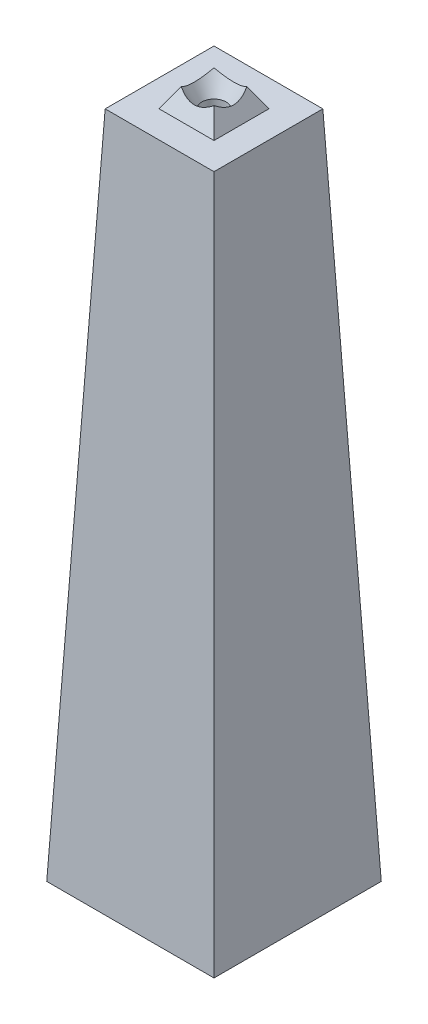
ISO-10303-21;
HEADER;
FILE_DESCRIPTION(('STEP AP214'),'2;1');
FILE_NAME('part.step','',(''),(''),'','','');
FILE_SCHEMA(('AUTOMOTIVE_DESIGN { 1 0 10303 214 1 1 1 1 }'));
ENDSEC;
DATA;
#1=APPLICATION_CONTEXT('core data for automotive mechanical design processes');
#2=APPLICATION_PROTOCOL_DEFINITION('international standard','automotive_design',2000,#1);
#3=PRODUCT_CONTEXT('',#1,'mechanical');
#4=PRODUCT('Part','Part','',(#3));
#5=PRODUCT_RELATED_PRODUCT_CATEGORY('part','',(#4));
#6=PRODUCT_DEFINITION_FORMATION('','',#4);
#7=PRODUCT_DEFINITION_CONTEXT('part definition',#1,'design');
#8=PRODUCT_DEFINITION('design','',#6,#7);
#9=PRODUCT_DEFINITION_SHAPE('','',#8);
#10=(LENGTH_UNIT() NAMED_UNIT(*) SI_UNIT(.MILLI.,.METRE.));
#11=(NAMED_UNIT(*) PLANE_ANGLE_UNIT() SI_UNIT($,.RADIAN.));
#12=(NAMED_UNIT(*) SI_UNIT($,.STERADIAN.) SOLID_ANGLE_UNIT());
#13=UNCERTAINTY_MEASURE_WITH_UNIT(LENGTH_MEASURE(1.E-05),#10,'distance_accuracy_value','');
#14=(GEOMETRIC_REPRESENTATION_CONTEXT(3) GLOBAL_UNCERTAINTY_ASSIGNED_CONTEXT((#13)) GLOBAL_UNIT_ASSIGNED_CONTEXT((#10,
#11,#12)) REPRESENTATION_CONTEXT('',''));
#15=CARTESIAN_POINT('',(0.,0.,0.));
#16=DIRECTION('',(0.,0.,1.));
#17=DIRECTION('',(1.,0.,0.));
#18=AXIS2_PLACEMENT_3D('',#15,#16,#17);
#19=CARTESIAN_POINT('',(0.,190.5,0.));
#20=DIRECTION('',(0.,1.,0.));
#21=DIRECTION('',(0.,0.,1.));
#22=AXIS2_PLACEMENT_3D('',#19,#20,#21);
#23=PLANE('',#22);
#24=DIRECTION('',(0.,0.,-1.));
#25=VECTOR('',#24,1.);
#26=CARTESIAN_POINT('',(8.31740962407157,190.5,0.));
#27=LINE('',#26,#25);
#28=CARTESIAN_POINT('',(8.31740962407157,190.5,8.31740962407157));
#29=VERTEX_POINT('',#28);
#30=CARTESIAN_POINT('',(8.31740962407157,190.5,39.3075903759284));
#31=VERTEX_POINT('',#30);
#32=EDGE_CURVE('E196',#29,#31,#27,.F.);
#33=ORIENTED_EDGE('',*,*,#32,.T.);
#34=DIRECTION('',(-1.,0.,0.));
#35=VECTOR('',#34,1.);
#36=CARTESIAN_POINT('',(0.,190.5,39.3075903759284));
#37=LINE('',#36,#35);
#38=CARTESIAN_POINT('',(39.3075903759284,190.5,39.3075903759284));
#39=VERTEX_POINT('',#38);
#40=EDGE_CURVE('E198',#31,#39,#37,.F.);
#41=ORIENTED_EDGE('',*,*,#40,.T.);
#42=DIRECTION('',(0.,0.,1.));
#43=VECTOR('',#42,1.);
#44=CARTESIAN_POINT('',(39.3075903759284,190.5,0.));
#45=LINE('',#44,#43);
#46=CARTESIAN_POINT('',(39.3075903759284,190.5,8.31740962407157));
#47=VERTEX_POINT('',#46);
#48=EDGE_CURVE('E64',#39,#47,#45,.F.);
#49=ORIENTED_EDGE('',*,*,#48,.T.);
#50=DIRECTION('',(1.,0.,0.));
#51=VECTOR('',#50,1.);
#52=CARTESIAN_POINT('',(0.,190.5,8.31740962407157));
#53=LINE('',#52,#51);
#54=EDGE_CURVE('E199',#47,#29,#53,.F.);
#55=ORIENTED_EDGE('',*,*,#54,.T.);
#56=EDGE_LOOP('',(#33,#41,#49,#55));
#57=FACE_BOUND('',#56,.T.);
#58=DIRECTION('',(1.,0.,0.));
#59=VECTOR('',#58,1.);
#60=CARTESIAN_POINT('',(16.002,190.5,31.623));
#61=LINE('',#60,#59);
#62=CARTESIAN_POINT('',(16.002,190.5,31.623));
#63=VERTEX_POINT('',#62);
#64=CARTESIAN_POINT('',(31.623,190.5,31.623));
#65=VERTEX_POINT('',#64);
#66=EDGE_CURVE('E111',#63,#65,#61,.T.);
#67=ORIENTED_EDGE('',*,*,#66,.F.);
#68=DIRECTION('',(0.,0.,1.));
#69=VECTOR('',#68,1.);
#70=CARTESIAN_POINT('',(16.002,190.5,16.002));
#71=LINE('',#70,#69);
#72=CARTESIAN_POINT('',(16.002,190.5,16.002));
#73=VERTEX_POINT('',#72);
#74=EDGE_CURVE('E121',#73,#63,#71,.T.);
#75=ORIENTED_EDGE('',*,*,#74,.F.);
#76=DIRECTION('',(-1.,0.,0.));
#77=VECTOR('',#76,1.);
#78=CARTESIAN_POINT('',(16.002,190.5,16.002));
#79=LINE('',#78,#77);
#80=CARTESIAN_POINT('',(31.623,190.5,16.002));
#81=VERTEX_POINT('',#80);
#82=EDGE_CURVE('E130',#81,#73,#79,.T.);
#83=ORIENTED_EDGE('',*,*,#82,.F.);
#84=DIRECTION('',(0.,0.,-1.));
#85=VECTOR('',#84,1.);
#86=CARTESIAN_POINT('',(31.623,190.5,16.002));
#87=LINE('',#86,#85);
#88=EDGE_CURVE('E56',#65,#81,#87,.T.);
#89=ORIENTED_EDGE('',*,*,#88,.F.);
#90=EDGE_LOOP('',(#67,#75,#83,#89));
#91=FACE_BOUND('',#90,.T.);
#92=ADVANCED_FACE('F39',(#57,#91),#23,.T.);
#93=CARTESIAN_POINT('',(0.,0.,0.));
#94=DIRECTION('',(-0.999048221581858,0.0436193873653361,0.));
#95=DIRECTION('',(-0.0436193873653361,-0.999048221581858,0.));
#96=AXIS2_PLACEMENT_3D('',#93,#94,#95);
#97=PLANE('',#96);
#98=ORIENTED_EDGE('',*,*,#32,.F.);
#99=DIRECTION('',(-0.0435779502517479,-0.998099155647229,-0.0435779502517479));
#100=VECTOR('',#99,1.);
#101=CARTESIAN_POINT('',(0.,0.,0.));
#102=LINE('',#101,#100);
#103=CARTESIAN_POINT('',(0.,0.,0.));
#104=VERTEX_POINT('',#103);
#105=EDGE_CURVE('E212',#29,#104,#102,.T.);
#106=ORIENTED_EDGE('',*,*,#105,.T.);
#107=DIRECTION('',(0.,0.,1.));
#108=VECTOR('',#107,1.);
#109=CARTESIAN_POINT('',(0.,0.,0.));
#110=LINE('',#109,#108);
#111=CARTESIAN_POINT('',(0.,0.,47.625));
#112=VERTEX_POINT('',#111);
#113=EDGE_CURVE('E211',#104,#112,#110,.T.);
#114=ORIENTED_EDGE('',*,*,#113,.T.);
#115=DIRECTION('',(-0.0435779502517479,-0.998099155647229,0.0435779502517479));
#116=VECTOR('',#115,1.);
#117=CARTESIAN_POINT('',(0.,0.,47.625));
#118=LINE('',#117,#116);
#119=EDGE_CURVE('E11',#31,#112,#118,.T.);
#120=ORIENTED_EDGE('',*,*,#119,.F.);
#121=EDGE_LOOP('',(#98,#106,#114,#120));
#122=FACE_BOUND('',#121,.T.);
#123=ADVANCED_FACE('F188',(#122),#97,.T.);
#124=CARTESIAN_POINT('',(0.,0.,47.625));
#125=DIRECTION('',(0.,0.0436193873653361,0.999048221581858));
#126=DIRECTION('',(0.,-0.999048221581858,0.0436193873653361));
#127=AXIS2_PLACEMENT_3D('',#124,#125,#126);
#128=PLANE('',#127);
#129=ORIENTED_EDGE('',*,*,#40,.F.);
#130=ORIENTED_EDGE('',*,*,#119,.T.);
#131=DIRECTION('',(1.,0.,0.));
#132=VECTOR('',#131,1.);
#133=CARTESIAN_POINT('',(0.,0.,47.625));
#134=LINE('',#133,#132);
#135=CARTESIAN_POINT('',(47.625,0.,47.625));
#136=VERTEX_POINT('',#135);
#137=EDGE_CURVE('E216',#112,#136,#134,.T.);
#138=ORIENTED_EDGE('',*,*,#137,.T.);
#139=DIRECTION('',(0.0435779502517479,-0.998099155647229,0.0435779502517479));
#140=VECTOR('',#139,1.);
#141=CARTESIAN_POINT('',(47.5345583272447,2.07145486859645,47.5345583272447));
#142=LINE('',#141,#140);
#143=EDGE_CURVE('E48',#39,#136,#142,.T.);
#144=ORIENTED_EDGE('',*,*,#143,.F.);
#145=EDGE_LOOP('',(#129,#130,#138,#144));
#146=FACE_BOUND('',#145,.T.);
#147=ADVANCED_FACE('F41',(#146),#128,.T.);
#148=CARTESIAN_POINT('',(47.625,0.,0.));
#149=DIRECTION('',(0.999048221581858,0.0436193873653361,0.));
#150=DIRECTION('',(-0.0436193873653361,0.999048221581858,0.));
#151=AXIS2_PLACEMENT_3D('',#148,#149,#150);
#152=PLANE('',#151);
#153=ORIENTED_EDGE('',*,*,#48,.F.);
#154=ORIENTED_EDGE('',*,*,#143,.T.);
#155=DIRECTION('',(0.,0.,-1.));
#156=VECTOR('',#155,1.);
#157=CARTESIAN_POINT('',(47.625,0.,0.));
#158=LINE('',#157,#156);
#159=CARTESIAN_POINT('',(47.625,0.,0.));
#160=VERTEX_POINT('',#159);
#161=EDGE_CURVE('E218',#136,#160,#158,.T.);
#162=ORIENTED_EDGE('',*,*,#161,.T.);
#163=DIRECTION('',(0.0435779502517479,-0.998099155647229,-0.0435779502517479));
#164=VECTOR('',#163,1.);
#165=CARTESIAN_POINT('',(47.5345583272446,2.07145486859645,0.090441672755349));
#166=LINE('',#165,#164);
#167=EDGE_CURVE('E228',#47,#160,#166,.T.);
#168=ORIENTED_EDGE('',*,*,#167,.F.);
#169=EDGE_LOOP('',(#153,#154,#162,#168));
#170=FACE_BOUND('',#169,.T.);
#171=ADVANCED_FACE('F230',(#170),#152,.T.);
#172=CARTESIAN_POINT('',(0.,0.,0.));
#173=DIRECTION('',(0.,0.0436193873653361,-0.999048221581858));
#174=DIRECTION('',(0.,0.999048221581858,0.0436193873653361));
#175=AXIS2_PLACEMENT_3D('',#172,#173,#174);
#176=PLANE('',#175);
#177=ORIENTED_EDGE('',*,*,#54,.F.);
#178=ORIENTED_EDGE('',*,*,#167,.T.);
#179=DIRECTION('',(-1.,0.,0.));
#180=VECTOR('',#179,1.);
#181=CARTESIAN_POINT('',(0.,0.,0.));
#182=LINE('',#181,#180);
#183=EDGE_CURVE('E225',#160,#104,#182,.T.);
#184=ORIENTED_EDGE('',*,*,#183,.T.);
#185=ORIENTED_EDGE('',*,*,#105,.F.);
#186=EDGE_LOOP('',(#177,#178,#184,#185));
#187=FACE_BOUND('',#186,.T.);
#188=ADVANCED_FACE('F234',(#187),#176,.T.);
#189=CARTESIAN_POINT('',(23.8125,381.,23.8125));
#190=DIRECTION('',(0.,-1.,0.));
#191=DIRECTION('',(0.,0.,-1.));
#192=AXIS2_PLACEMENT_3D('',#189,#190,#191);
#193=CYLINDRICAL_SURFACE('',#192,3.429);
#194=CARTESIAN_POINT('',(23.8125,0.,23.8125));
#195=DIRECTION('',(0.,-1.,0.));
#196=DIRECTION('',(0.,0.,-1.));
#197=AXIS2_PLACEMENT_3D('',#194,#195,#196);
#198=CIRCLE('',#197,3.429);
#199=CARTESIAN_POINT('',(23.8125,0.,20.3835));
#200=VERTEX_POINT('',#199);
#201=EDGE_CURVE('E202',#200,#200,#198,.T.);
#202=ORIENTED_EDGE('',*,*,#201,.T.);
#203=EDGE_LOOP('',(#202));
#204=FACE_BOUND('',#203,.T.);
#205=CARTESIAN_POINT('',(23.8125,190.5,23.8125));
#206=DIRECTION('',(0.,1.,0.));
#207=DIRECTION('',(0.,0.,1.));
#208=AXIS2_PLACEMENT_3D('',#205,#206,#207);
#209=CIRCLE('',#208,3.429);
#210=CARTESIAN_POINT('',(23.8125,190.5,27.2415));
#211=VERTEX_POINT('',#210);
#212=EDGE_CURVE('E43',#211,#211,#209,.F.);
#213=ORIENTED_EDGE('',*,*,#212,.F.);
#214=EDGE_LOOP('',(#213));
#215=FACE_BOUND('',#214,.T.);
#216=ADVANCED_FACE('F240',(#204,#215),#193,.F.);
#217=CARTESIAN_POINT('',(0.,0.,0.));
#218=DIRECTION('',(0.,1.,0.));
#219=DIRECTION('',(0.,0.,1.));
#220=AXIS2_PLACEMENT_3D('',#217,#218,#219);
#221=PLANE('',#220);
#222=ORIENTED_EDGE('',*,*,#201,.F.);
#223=EDGE_LOOP('',(#222));
#224=FACE_BOUND('',#223,.T.);
#225=ORIENTED_EDGE('',*,*,#113,.F.);
#226=ORIENTED_EDGE('',*,*,#183,.F.);
#227=ORIENTED_EDGE('',*,*,#161,.F.);
#228=ORIENTED_EDGE('',*,*,#137,.F.);
#229=EDGE_LOOP('',(#225,#226,#227,#228));
#230=FACE_BOUND('',#229,.T.);
#231=ADVANCED_FACE('F157',(#224,#230),#221,.F.);
#232=CARTESIAN_POINT('',(23.8125,190.5,23.8125));
#233=DIRECTION('',(0.,1.,0.));
#234=DIRECTION('',(0.,0.,1.));
#235=AXIS2_PLACEMENT_3D('',#232,#233,#234);
#236=CONICAL_SURFACE('',#235,3.429,0.5235987755983);
#237=ORIENTED_EDGE('',*,*,#212,.T.);
#238=EDGE_LOOP('',(#237));
#239=FACE_BOUND('',#238,.T.);
#240=CARTESIAN_POINT('',(27.956710320592,196.8502,29.5717235981434));
#241=CARTESIAN_POINT('',(28.0081323623795,196.761134410995,29.4713633439768));
#242=CARTESIAN_POINT('',(28.058901147704,196.673200295375,29.3696688244712));
#243=CARTESIAN_POINT('',(28.1589874871974,196.499845670228,29.1634177978636));
#244=CARTESIAN_POINT('',(28.2083046955904,196.414425759604,29.0588606201233));
#245=CARTESIAN_POINT('',(28.3541638434062,196.161790304839,28.7399375167267));
#246=CARTESIAN_POINT('',(28.4482525522244,195.998823880747,28.5210173220777));
#247=CARTESIAN_POINT('',(28.629861655085,195.684267687475,28.0656985218887));
#248=CARTESIAN_POINT('',(28.717225871974,195.53294842506,27.829049212438));
#249=CARTESIAN_POINT('',(28.8809444662537,195.249379501624,27.3412572281908));
#250=CARTESIAN_POINT('',(28.9573155063829,195.117100979893,27.0901373136578));
#251=CARTESIAN_POINT('',(29.0687968483862,194.924009631448,26.6751114965386));
#252=CARTESIAN_POINT('',(29.1082952728107,194.855596353526,26.5159025037141));
#253=CARTESIAN_POINT('',(29.1814947323029,194.728811170598,26.1921882833746));
#254=CARTESIAN_POINT('',(29.2151955750317,194.670439598734,26.0276828803624));
#255=CARTESIAN_POINT('',(29.2758636525543,194.565359406068,25.6947737922541));
#256=CARTESIAN_POINT('',(29.3028668941915,194.518588419583,25.5263965163288));
#257=CARTESIAN_POINT('',(29.3496598641811,194.437540618124,25.1856559610529));
#258=CARTESIAN_POINT('',(29.3694498950815,194.403263279121,25.0132928492052));
#259=CARTESIAN_POINT('',(29.4013912868527,194.347939165709,24.6637102617785));
#260=CARTESIAN_POINT('',(29.4134534189008,194.327046940154,24.4864578729925));
#261=CARTESIAN_POINT('',(29.4291618609886,194.29983912035,24.1304560582134));
#262=CARTESIAN_POINT('',(29.4328082527425,194.293523384568,23.9517066467727));
#263=CARTESIAN_POINT('',(29.4315529760501,194.295697587577,23.5943067876001));
#264=CARTESIAN_POINT('',(29.4266501885338,194.304189464654,23.4156563558865));
#265=CARTESIAN_POINT('',(29.4084712981696,194.33567622639,23.0600833599351));
#266=CARTESIAN_POINT('',(29.3951954273272,194.358670709204,22.8831607479602));
#267=CARTESIAN_POINT('',(29.3625571218628,194.415201912541,22.5510648433335));
#268=CARTESIAN_POINT('',(29.3439893162406,194.447362295264,22.3955745310005));
#269=CARTESIAN_POINT('',(29.3009864205335,194.521845495501,22.0878698309277));
#270=CARTESIAN_POINT('',(29.2765506147325,194.564169552672,21.9356558452689));
#271=CARTESIAN_POINT('',(29.2222308076464,194.658254218403,21.6344734718811));
#272=CARTESIAN_POINT('',(29.1923246189891,194.710053256618,21.4855211733471));
#273=CARTESIAN_POINT('',(29.1276982494997,194.821989412082,21.1918932661529));
#274=CARTESIAN_POINT('',(29.0929781859858,194.88212632613,21.0472175533728));
#275=CARTESIAN_POINT('',(28.9863508157211,195.066810348906,20.6350638534292));
#276=CARTESIAN_POINT('',(28.9089178533378,195.200928173934,20.3732680214732));
#277=CARTESIAN_POINT('',(28.7419687754171,195.49009245917,19.8651474813778));
#278=CARTESIAN_POINT('',(28.6524302770016,195.645177687659,19.6188527008429));
#279=CARTESIAN_POINT('',(28.511889339597,195.888601731787,19.2624927506049));
#280=CARTESIAN_POINT('',(28.4644117510802,195.970835327319,19.1467708093315));
#281=CARTESIAN_POINT('',(28.3674383261517,196.138798226279,18.9187378219393));
#282=CARTESIAN_POINT('',(28.3179423414553,196.224527786544,18.8064270274872));
#283=CARTESIAN_POINT('',(28.2173832535902,196.398701235889,18.5855371025006));
#284=CARTESIAN_POINT('',(28.1663277593534,196.487131945913,18.4769440647886));
#285=CARTESIAN_POINT('',(28.0626501651382,196.6667068067,18.2628457173472));
#286=CARTESIAN_POINT('',(28.0100284905361,196.75785022069,18.1573395843732));
#287=CARTESIAN_POINT('',(27.956710320592,196.8502,18.0532764018566));
#288=B_SPLINE_CURVE_WITH_KNOTS('',3,(#240,#241,#242,#243,#244,#245,#246,#247,#248,#249,#250,
#251,#252,#253,#254,#255,#256,#257,#258,#259,#260,#261,#262,#263,#264,#265,#266,#267,#268,#269,
#270,#271,#272,#273,#274,#275,#276,#277,#278,#279,#280,#281,#282,#283,#284,#285,#286,#287),
.UNSPECIFIED.,.F.,.F.,(4,2,2,2,2,2,2,2,2,2,2,2,2,2,2,2,2,2,2,2,2,2,2,4),(0.,0.431069751364838,
0.862241368956554,1.72759013397606,2.60915931907157,3.48937788189382,4.02218378409016,
4.55500735909969,5.08490112039099,5.6147726534632,6.15065695199229,6.68653604722868,
7.22248529320639,7.75841968949851,8.23752784730629,8.71669447132412,9.19784947299534,
9.67899275056092,10.5897014409924,11.5021176477477,11.9511220458907,12.4001594905094,
12.8472761877539,13.2942725362773),.UNSPECIFIED.);
#289=CARTESIAN_POINT('',(28.4680533342924,195.964527920176,28.4680533342924));
#290=VERTEX_POINT('',#289);
#291=CARTESIAN_POINT('',(28.4680533342924,195.964527920176,19.1569466657076));
#292=VERTEX_POINT('',#291);
#293=EDGE_CURVE('E166',#290,#292,#288,.T.);
#294=ORIENTED_EDGE('',*,*,#293,.T.);
#295=CARTESIAN_POINT('',(29.5717235981434,196.8502,19.668289679408));
#296=CARTESIAN_POINT('',(29.4713633439768,196.761134410995,19.6168676376205));
#297=CARTESIAN_POINT('',(29.3696688244712,196.673200295375,19.566098852296));
#298=CARTESIAN_POINT('',(29.1634177978636,196.499845670228,19.4660125128026));
#299=CARTESIAN_POINT('',(29.0588606201233,196.414425759604,19.4166953044096));
#300=CARTESIAN_POINT('',(28.7399375167267,196.161790304839,19.2708361565938));
#301=CARTESIAN_POINT('',(28.5210173220777,195.998823880747,19.1767474477756));
#302=CARTESIAN_POINT('',(28.0656985218887,195.684267687475,18.995138344915));
#303=CARTESIAN_POINT('',(27.829049212438,195.53294842506,18.907774128026));
#304=CARTESIAN_POINT('',(27.3412572281908,195.249379501624,18.7440555337463));
#305=CARTESIAN_POINT('',(27.0901373136578,195.117100979893,18.6676844936171));
#306=CARTESIAN_POINT('',(26.6751114965386,194.924009631448,18.5562031516138));
#307=CARTESIAN_POINT('',(26.5159025037141,194.855596353526,18.5167047271893));
#308=CARTESIAN_POINT('',(26.1921882833746,194.728811170598,18.4435052676971));
#309=CARTESIAN_POINT('',(26.0276828803624,194.670439598734,18.4098044249683));
#310=CARTESIAN_POINT('',(25.6947737922541,194.565359406068,18.3491363474457));
#311=CARTESIAN_POINT('',(25.5263965163288,194.518588419583,18.3221331058085));
#312=CARTESIAN_POINT('',(25.1856559610529,194.437540618124,18.2753401358189));
#313=CARTESIAN_POINT('',(25.0132928492052,194.403263279121,18.2555501049185));
#314=CARTESIAN_POINT('',(24.6637102617785,194.347939165709,18.2236087131473));
#315=CARTESIAN_POINT('',(24.4864578729925,194.327046940154,18.2115465810992));
#316=CARTESIAN_POINT('',(24.1304560582134,194.29983912035,18.1958381390114));
#317=CARTESIAN_POINT('',(23.9517066467727,194.293523384568,18.1921917472575));
#318=CARTESIAN_POINT('',(23.5943067876001,194.295697587577,18.1934470239499));
#319=CARTESIAN_POINT('',(23.4156563558865,194.304189464654,18.1983498114662));
#320=CARTESIAN_POINT('',(23.0600833599351,194.33567622639,18.2165287018304));
#321=CARTESIAN_POINT('',(22.8831607479602,194.358670709204,18.2298045726728));
#322=CARTESIAN_POINT('',(22.5510648433335,194.415201912541,18.2624428781372));
#323=CARTESIAN_POINT('',(22.3955745310005,194.447362295264,18.2810106837594));
#324=CARTESIAN_POINT('',(22.0878698309277,194.521845495501,18.3240135794665));
#325=CARTESIAN_POINT('',(21.9356558452689,194.564169552672,18.3484493852675));
#326=CARTESIAN_POINT('',(21.6344734718811,194.658254218403,18.4027691923536));
#327=CARTESIAN_POINT('',(21.4855211733471,194.710053256618,18.4326753810109));
#328=CARTESIAN_POINT('',(21.1918932661529,194.821989412082,18.4973017505003));
#329=CARTESIAN_POINT('',(21.0472175533728,194.88212632613,18.5320218140142));
#330=CARTESIAN_POINT('',(20.6350638534292,195.066810348906,18.6386491842789));
#331=CARTESIAN_POINT('',(20.3732680214732,195.200928173934,18.7160821466622));
#332=CARTESIAN_POINT('',(19.8651474813778,195.49009245917,18.883031224583));
#333=CARTESIAN_POINT('',(19.6188527008429,195.645177687659,18.9725697229984));
#334=CARTESIAN_POINT('',(19.2624927506049,195.888601731787,19.113110660403));
#335=CARTESIAN_POINT('',(19.1467708093315,195.970835327319,19.1605882489199));
#336=CARTESIAN_POINT('',(18.9187378219393,196.138798226279,19.2575616738483));
#337=CARTESIAN_POINT('',(18.8064270274872,196.224527786544,19.3070576585447));
#338=CARTESIAN_POINT('',(18.5855371025006,196.398701235889,19.4076167464099));
#339=CARTESIAN_POINT('',(18.4769440647886,196.487131945913,19.4586722406466));
#340=CARTESIAN_POINT('',(18.2628457173472,196.6667068067,19.5623498348619));
#341=CARTESIAN_POINT('',(18.1573395843732,196.75785022069,19.6149715094639));
#342=CARTESIAN_POINT('',(18.0532764018566,196.8502,19.668289679408));
#343=B_SPLINE_CURVE_WITH_KNOTS('',3,(#295,#296,#297,#298,#299,#300,#301,#302,#303,#304,#305,
#306,#307,#308,#309,#310,#311,#312,#313,#314,#315,#316,#317,#318,#319,#320,#321,#322,#323,#324,
#325,#326,#327,#328,#329,#330,#331,#332,#333,#334,#335,#336,#337,#338,#339,#340,#341,#342),
.UNSPECIFIED.,.F.,.F.,(4,2,2,2,2,2,2,2,2,2,2,2,2,2,2,2,2,2,2,2,2,2,2,4),(0.,0.431069751364856,
0.862241368956557,1.72759013397606,2.60915931907158,3.48937788189382,4.02218378409016,
4.5550073590997,5.08490112039099,5.61477265346321,6.15065695199229,6.68653604722868,
7.22248529320639,7.7584196894985,8.23752784730628,8.71669447132413,9.19784947299533,
9.67899275056092,10.5897014409924,11.5021176477477,11.9511220458907,12.4001594905094,
12.8472761877539,13.2942725362773),.UNSPECIFIED.);
#344=CARTESIAN_POINT('',(19.1569466657076,195.964527920176,19.1569466657076));
#345=VERTEX_POINT('',#344);
#346=EDGE_CURVE('E172',#292,#345,#343,.T.);
#347=ORIENTED_EDGE('',*,*,#346,.T.);
#348=CARTESIAN_POINT('',(19.668289679408,196.8502,18.0532764018566));
#349=CARTESIAN_POINT('',(19.6168676376206,196.761134410995,18.1536366560232));
#350=CARTESIAN_POINT('',(19.566098852296,196.673200295375,18.2553311755288));
#351=CARTESIAN_POINT('',(19.4660125128026,196.499845670228,18.4615822021364));
#352=CARTESIAN_POINT('',(19.4166953044096,196.414425759604,18.5661393798766));
#353=CARTESIAN_POINT('',(19.2708361565938,196.161790304839,18.8850624832733));
#354=CARTESIAN_POINT('',(19.1767474477756,195.998823880747,19.1039826779223));
#355=CARTESIAN_POINT('',(18.995138344915,195.684267687475,19.5593014781113));
#356=CARTESIAN_POINT('',(18.907774128026,195.53294842506,19.795950787562));
#357=CARTESIAN_POINT('',(18.7440555337463,195.249379501624,20.2837427718092));
#358=CARTESIAN_POINT('',(18.6676844936171,195.117100979893,20.5348626863422));
#359=CARTESIAN_POINT('',(18.5562031516138,194.924009631448,20.9498885034614));
#360=CARTESIAN_POINT('',(18.5167047271893,194.855596353526,21.1090974962859));
#361=CARTESIAN_POINT('',(18.4435052676971,194.728811170598,21.4328117166254));
#362=CARTESIAN_POINT('',(18.4098044249683,194.670439598734,21.5973171196376));
#363=CARTESIAN_POINT('',(18.3491363474457,194.565359406068,21.9302262077459));
#364=CARTESIAN_POINT('',(18.3221331058085,194.518588419583,22.0986034836712));
#365=CARTESIAN_POINT('',(18.2753401358189,194.437540618124,22.4393440389472));
#366=CARTESIAN_POINT('',(18.2555501049185,194.403263279121,22.6117071507948));
#367=CARTESIAN_POINT('',(18.2236087131473,194.347939165709,22.9612897382215));
#368=CARTESIAN_POINT('',(18.2115465810992,194.327046940154,23.1385421270075));
#369=CARTESIAN_POINT('',(18.1958381390114,194.29983912035,23.4945439417866));
#370=CARTESIAN_POINT('',(18.1921917472575,194.293523384568,23.6732933532273));
#371=CARTESIAN_POINT('',(18.1934470239499,194.295697587577,24.0306932123999));
#372=CARTESIAN_POINT('',(18.1983498114662,194.304189464654,24.2093436441135));
#373=CARTESIAN_POINT('',(18.2165287018304,194.33567622639,24.5649166400649));
#374=CARTESIAN_POINT('',(18.2298045726728,194.358670709204,24.7418392520398));
#375=CARTESIAN_POINT('',(18.2624428781372,194.415201912541,25.0739351566665));
#376=CARTESIAN_POINT('',(18.2810106837594,194.447362295264,25.2294254689995));
#377=CARTESIAN_POINT('',(18.3240135794665,194.521845495501,25.5371301690723));
#378=CARTESIAN_POINT('',(18.3484493852675,194.564169552672,25.6893441547311));
#379=CARTESIAN_POINT('',(18.4027691923536,194.658254218403,25.9905265281189));
#380=CARTESIAN_POINT('',(18.4326753810109,194.710053256618,26.1394788266529));
#381=CARTESIAN_POINT('',(18.4973017505003,194.821989412082,26.4331067338471));
#382=CARTESIAN_POINT('',(18.5320218140142,194.88212632613,26.5777824466272));
#383=CARTESIAN_POINT('',(18.6386491842789,195.066810348906,26.9899361465709));
#384=CARTESIAN_POINT('',(18.7160821466622,195.200928173934,27.2517319785268));
#385=CARTESIAN_POINT('',(18.8830312245829,195.49009245917,27.7598525186222));
#386=CARTESIAN_POINT('',(18.9725697229984,195.645177687659,28.0061472991571));
#387=CARTESIAN_POINT('',(19.113110660403,195.888601731787,28.3625072493951));
#388=CARTESIAN_POINT('',(19.1605882489198,195.970835327319,28.4782291906685));
#389=CARTESIAN_POINT('',(19.2575616738483,196.138798226279,28.7062621780607));
#390=CARTESIAN_POINT('',(19.3070576585447,196.224527786544,28.8185729725128));
#391=CARTESIAN_POINT('',(19.4076167464098,196.398701235889,29.0394628974994));
#392=CARTESIAN_POINT('',(19.4586722406466,196.487131945913,29.1480559352114));
#393=CARTESIAN_POINT('',(19.5623498348618,196.6667068067,29.3621542826528));
#394=CARTESIAN_POINT('',(19.6149715094639,196.75785022069,29.4676604156268));
#395=CARTESIAN_POINT('',(19.668289679408,196.8502,29.5717235981434));
#396=B_SPLINE_CURVE_WITH_KNOTS('',3,(#348,#349,#350,#351,#352,#353,#354,#355,#356,#357,#358,
#359,#360,#361,#362,#363,#364,#365,#366,#367,#368,#369,#370,#371,#372,#373,#374,#375,#376,#377,
#378,#379,#380,#381,#382,#383,#384,#385,#386,#387,#388,#389,#390,#391,#392,#393,#394,#395),
.UNSPECIFIED.,.F.,.F.,(4,2,2,2,2,2,2,2,2,2,2,2,2,2,2,2,2,2,2,2,2,2,2,4),(0.,0.43106975136482,
0.862241368956516,1.72759013397603,2.60915931907153,3.48937788189381,4.02218378409014,
4.55500735909968,5.08490112039099,5.6147726534632,6.15065695199228,6.68653604722867,
7.22248529320638,7.75841968949849,8.23752784730626,8.71669447132411,9.19784947299532,
9.67899275056091,10.5897014409924,11.5021176477477,11.9511220458907,12.4001594905094,
12.8472761877538,13.2942725362773),.UNSPECIFIED.);
#397=CARTESIAN_POINT('',(19.1569466657076,195.964527920176,28.4680533342924));
#398=VERTEX_POINT('',#397);
#399=EDGE_CURVE('E117',#345,#398,#396,.T.);
#400=ORIENTED_EDGE('',*,*,#399,.T.);
#401=CARTESIAN_POINT('',(18.0532764018566,196.8502,27.956710320592));
#402=CARTESIAN_POINT('',(18.1536366560232,196.761134410995,28.0081323623795));
#403=CARTESIAN_POINT('',(18.2553311755288,196.673200295375,28.058901147704));
#404=CARTESIAN_POINT('',(18.4615822021364,196.499845670228,28.1589874871974));
#405=CARTESIAN_POINT('',(18.5661393798766,196.414425759604,28.2083046955904));
#406=CARTESIAN_POINT('',(18.8850624832733,196.161790304839,28.3541638434062));
#407=CARTESIAN_POINT('',(19.1039826779223,195.998823880747,28.4482525522244));
#408=CARTESIAN_POINT('',(19.5593014781113,195.684267687475,28.629861655085));
#409=CARTESIAN_POINT('',(19.795950787562,195.53294842506,28.717225871974));
#410=CARTESIAN_POINT('',(20.2837427718092,195.249379501624,28.8809444662537));
#411=CARTESIAN_POINT('',(20.5348626863422,195.117100979893,28.9573155063829));
#412=CARTESIAN_POINT('',(20.9498885034614,194.924009631448,29.0687968483862));
#413=CARTESIAN_POINT('',(21.109097496286,194.855596353526,29.1082952728107));
#414=CARTESIAN_POINT('',(21.4328117166254,194.728811170598,29.1814947323029));
#415=CARTESIAN_POINT('',(21.5973171196376,194.670439598734,29.2151955750317));
#416=CARTESIAN_POINT('',(21.9302262077459,194.565359406068,29.2758636525543));
#417=CARTESIAN_POINT('',(22.0986034836712,194.518588419583,29.3028668941915));
#418=CARTESIAN_POINT('',(22.4393440389472,194.437540618124,29.3496598641811));
#419=CARTESIAN_POINT('',(22.6117071507948,194.403263279121,29.3694498950815));
#420=CARTESIAN_POINT('',(22.9612897382215,194.347939165709,29.4013912868527));
#421=CARTESIAN_POINT('',(23.1385421270075,194.327046940154,29.4134534189008));
#422=CARTESIAN_POINT('',(23.4945439417867,194.29983912035,29.4291618609886));
#423=CARTESIAN_POINT('',(23.6732933532273,194.293523384568,29.4328082527425));
#424=CARTESIAN_POINT('',(24.0306932123999,194.295697587577,29.4315529760501));
#425=CARTESIAN_POINT('',(24.2093436441136,194.304189464654,29.4266501885338));
#426=CARTESIAN_POINT('',(24.5649166400649,194.33567622639,29.4084712981696));
#427=CARTESIAN_POINT('',(24.7418392520398,194.358670709204,29.3951954273272));
#428=CARTESIAN_POINT('',(25.0739351566665,194.415201912541,29.3625571218628));
#429=CARTESIAN_POINT('',(25.2294254689995,194.447362295264,29.3439893162406));
#430=CARTESIAN_POINT('',(25.5371301690723,194.521845495501,29.3009864205335));
#431=CARTESIAN_POINT('',(25.6893441547311,194.564169552672,29.2765506147325));
#432=CARTESIAN_POINT('',(25.9905265281189,194.658254218403,29.2222308076464));
#433=CARTESIAN_POINT('',(26.1394788266529,194.710053256618,29.1923246189891));
#434=CARTESIAN_POINT('',(26.4331067338471,194.821989412082,29.1276982494997));
#435=CARTESIAN_POINT('',(26.5777824466272,194.88212632613,29.0929781859858));
#436=CARTESIAN_POINT('',(26.9899361465709,195.066810348906,28.9863508157211));
#437=CARTESIAN_POINT('',(27.2517319785268,195.200928173934,28.9089178533378));
#438=CARTESIAN_POINT('',(27.7598525186222,195.49009245917,28.7419687754171));
#439=CARTESIAN_POINT('',(28.0061472991571,195.645177687659,28.6524302770016));
#440=CARTESIAN_POINT('',(28.3625072493952,195.888601731787,28.511889339597));
#441=CARTESIAN_POINT('',(28.4782291906685,195.970835327319,28.4644117510801));
#442=CARTESIAN_POINT('',(28.7062621780608,196.138798226279,28.3674383261517));
#443=CARTESIAN_POINT('',(28.8185729725129,196.224527786544,28.3179423414553));
#444=CARTESIAN_POINT('',(29.0394628974994,196.398701235889,28.2173832535902));
#445=CARTESIAN_POINT('',(29.1480559352114,196.487131945913,28.1663277593534));
#446=CARTESIAN_POINT('',(29.3621542826528,196.6667068067,28.0626501651382));
#447=CARTESIAN_POINT('',(29.4676604156268,196.75785022069,28.0100284905361));
#448=CARTESIAN_POINT('',(29.5717235981434,196.8502,27.956710320592));
#449=B_SPLINE_CURVE_WITH_KNOTS('',3,(#401,#402,#403,#404,#405,#406,#407,#408,#409,#410,#411,
#412,#413,#414,#415,#416,#417,#418,#419,#420,#421,#422,#423,#424,#425,#426,#427,#428,#429,#430,
#431,#432,#433,#434,#435,#436,#437,#438,#439,#440,#441,#442,#443,#444,#445,#446,#447,#448),
.UNSPECIFIED.,.F.,.F.,(4,2,2,2,2,2,2,2,2,2,2,2,2,2,2,2,2,2,2,2,2,2,2,4),(0.,0.431069751364829,
0.862241368956516,1.72759013397603,2.60915931907156,3.48937788189382,4.02218378409015,
4.5550073590997,5.08490112039099,5.61477265346321,6.1506569519923,6.68653604722868,
7.22248529320639,7.7584196894985,8.23752784730629,8.71669447132412,9.19784947299533,
9.67899275056092,10.5897014409924,11.5021176477477,11.9511220458907,12.4001594905094,
12.8472761877538,13.2942725362773),.UNSPECIFIED.);
#450=EDGE_CURVE('E113',#398,#290,#449,.T.);
#451=ORIENTED_EDGE('',*,*,#450,.T.);
#452=EDGE_LOOP('',(#294,#347,#400,#451));
#453=FACE_BOUND('',#452,.T.);
#454=ADVANCED_FACE('F153',(#239,#453),#236,.F.);
#455=CARTESIAN_POINT('',(16.002,190.5,16.002));
#456=DIRECTION('',(-0.866025403784438,0.500000000000001,0.));
#457=DIRECTION('',(-0.500000000000001,-0.866025403784438,0.));
#458=AXIS2_PLACEMENT_3D('',#455,#456,#457);
#459=PLANE('',#458);
#460=ORIENTED_EDGE('',*,*,#399,.F.);
#461=DIRECTION('',(-0.447213595499959,-0.774596669241482,-0.447213595499959));
#462=VECTOR('',#461,1.);
#463=CARTESIAN_POINT('',(16.002,190.5,16.002));
#464=LINE('',#463,#462);
#465=EDGE_CURVE('E124',#345,#73,#464,.T.);
#466=ORIENTED_EDGE('',*,*,#465,.T.);
#467=ORIENTED_EDGE('',*,*,#74,.T.);
#468=DIRECTION('',(-0.447213595499959,-0.774596669241482,0.447213595499959));
#469=VECTOR('',#468,1.);
#470=CARTESIAN_POINT('',(16.002,190.5,31.623));
#471=LINE('',#470,#469);
#472=EDGE_CURVE('E106',#398,#63,#471,.T.);
#473=ORIENTED_EDGE('',*,*,#472,.F.);
#474=EDGE_LOOP('',(#460,#466,#467,#473));
#475=FACE_BOUND('',#474,.T.);
#476=ADVANCED_FACE('F122',(#475),#459,.T.);
#477=CARTESIAN_POINT('',(16.002,190.5,31.623));
#478=DIRECTION('',(0.,0.500000000000001,0.866025403784438));
#479=DIRECTION('',(0.,-0.866025403784438,0.500000000000001));
#480=AXIS2_PLACEMENT_3D('',#477,#478,#479);
#481=PLANE('',#480);
#482=ORIENTED_EDGE('',*,*,#450,.F.);
#483=ORIENTED_EDGE('',*,*,#472,.T.);
#484=ORIENTED_EDGE('',*,*,#66,.T.);
#485=DIRECTION('',(0.447213595499959,-0.774596669241483,0.447213595499958));
#486=VECTOR('',#485,1.);
#487=CARTESIAN_POINT('',(28.4988,195.911273133007,28.4988));
#488=LINE('',#487,#486);
#489=EDGE_CURVE('E118',#290,#65,#488,.T.);
#490=ORIENTED_EDGE('',*,*,#489,.F.);
#491=EDGE_LOOP('',(#482,#483,#484,#490));
#492=FACE_BOUND('',#491,.T.);
#493=ADVANCED_FACE('F108',(#492),#481,.T.);
#494=CARTESIAN_POINT('',(31.623,190.5,16.002));
#495=DIRECTION('',(0.866025403784438,0.500000000000001,0.));
#496=DIRECTION('',(-0.500000000000001,0.866025403784438,0.));
#497=AXIS2_PLACEMENT_3D('',#494,#495,#496);
#498=PLANE('',#497);
#499=ORIENTED_EDGE('',*,*,#293,.F.);
#500=ORIENTED_EDGE('',*,*,#489,.T.);
#501=ORIENTED_EDGE('',*,*,#88,.T.);
#502=DIRECTION('',(0.447213595499959,-0.774596669241482,-0.447213595499959));
#503=VECTOR('',#502,1.);
#504=CARTESIAN_POINT('',(28.4988,195.911273133007,19.1262));
#505=LINE('',#504,#503);
#506=EDGE_CURVE('E135',#292,#81,#505,.T.);
#507=ORIENTED_EDGE('',*,*,#506,.F.);
#508=EDGE_LOOP('',(#499,#500,#501,#507));
#509=FACE_BOUND('',#508,.T.);
#510=ADVANCED_FACE('F178',(#509),#498,.T.);
#511=CARTESIAN_POINT('',(16.002,190.5,16.002));
#512=DIRECTION('',(0.,0.500000000000001,-0.866025403784438));
#513=DIRECTION('',(0.,0.866025403784438,0.500000000000001));
#514=AXIS2_PLACEMENT_3D('',#511,#512,#513);
#515=PLANE('',#514);
#516=ORIENTED_EDGE('',*,*,#346,.F.);
#517=ORIENTED_EDGE('',*,*,#506,.T.);
#518=ORIENTED_EDGE('',*,*,#82,.T.);
#519=ORIENTED_EDGE('',*,*,#465,.F.);
#520=EDGE_LOOP('',(#516,#517,#518,#519));
#521=FACE_BOUND('',#520,.T.);
#522=ADVANCED_FACE('F181',(#521),#515,.T.);
#523=CLOSED_SHELL('',(#92,#123,#147,#171,#188,#216,#231,#454,#476,#493,#510,#522));
#524=MANIFOLD_SOLID_BREP('B2',#523);
#525=ADVANCED_BREP_SHAPE_REPRESENTATION('',(#18,#524),#14);
#526=SHAPE_DEFINITION_REPRESENTATION(#9,#525);
ENDSEC;
END-ISO-10303-21;
